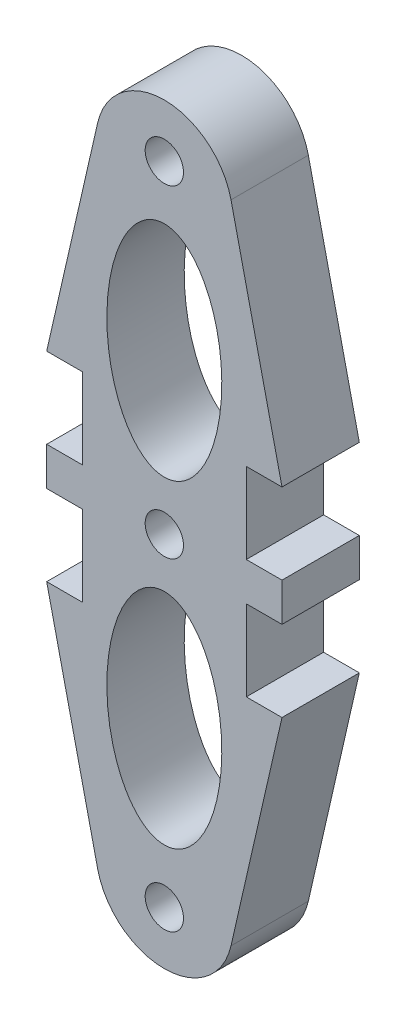
ISO-10303-21;
HEADER;
FILE_DESCRIPTION(('STEP AP214'),'2;1');
FILE_NAME('part.step','',(''),(''),'','','');
FILE_SCHEMA(('AUTOMOTIVE_DESIGN { 1 0 10303 214 1 1 1 1 }'));
ENDSEC;
DATA;
#1=APPLICATION_CONTEXT('core data for automotive mechanical design processes');
#2=APPLICATION_PROTOCOL_DEFINITION('international standard','automotive_design',2000,#1);
#3=PRODUCT_CONTEXT('',#1,'mechanical');
#4=PRODUCT('Part','Part','',(#3));
#5=PRODUCT_RELATED_PRODUCT_CATEGORY('part','',(#4));
#6=PRODUCT_DEFINITION_FORMATION('','',#4);
#7=PRODUCT_DEFINITION_CONTEXT('part definition',#1,'design');
#8=PRODUCT_DEFINITION('design','',#6,#7);
#9=PRODUCT_DEFINITION_SHAPE('','',#8);
#10=(LENGTH_UNIT() NAMED_UNIT(*) SI_UNIT(.MILLI.,.METRE.));
#11=(NAMED_UNIT(*) PLANE_ANGLE_UNIT() SI_UNIT($,.RADIAN.));
#12=(NAMED_UNIT(*) SI_UNIT($,.STERADIAN.) SOLID_ANGLE_UNIT());
#13=UNCERTAINTY_MEASURE_WITH_UNIT(LENGTH_MEASURE(1.E-05),#10,'distance_accuracy_value','');
#14=(GEOMETRIC_REPRESENTATION_CONTEXT(3) GLOBAL_UNCERTAINTY_ASSIGNED_CONTEXT((#13)) GLOBAL_UNIT_ASSIGNED_CONTEXT((#10,
#11,#12)) REPRESENTATION_CONTEXT('',''));
#15=CARTESIAN_POINT('',(0.,0.,0.));
#16=DIRECTION('',(0.,0.,1.));
#17=DIRECTION('',(1.,0.,0.));
#18=AXIS2_PLACEMENT_3D('',#15,#16,#17);
#19=CARTESIAN_POINT('',(839.100067992769,191.617907065036,5.85));
#20=DIRECTION('',(0.974903005259074,0.222630030177482,0.));
#21=DIRECTION('',(-0.222630030177482,0.974903005259074,0.));
#22=AXIS2_PLACEMENT_3D('',#19,#20,#21);
#23=PLANE('',#22);
#24=DIRECTION('',(0.222630030177482,-0.974903005259074,0.));
#25=VECTOR('',#24,1.);
#26=CARTESIAN_POINT('',(839.100067992769,191.617907065036,0.));
#27=LINE('',#26,#25);
#28=CARTESIAN_POINT('',(778.759168708765,455.852359196733,0.));
#29=VERTEX_POINT('',#28);
#30=CARTESIAN_POINT('',(782.615047744186,438.967359196733,0.));
#31=VERTEX_POINT('',#30);
#32=EDGE_CURVE('E316',#29,#31,#27,.T.);
#33=ORIENTED_EDGE('',*,*,#32,.T.);
#34=DIRECTION('',(0.,0.,-1.));
#35=VECTOR('',#34,1.);
#36=CARTESIAN_POINT('',(782.615047744186,438.967359196733,5.85));
#37=LINE('',#36,#35);
#38=CARTESIAN_POINT('',(782.615047744186,438.967359196733,5.85));
#39=VERTEX_POINT('',#38);
#40=EDGE_CURVE('E11',#39,#31,#37,.T.);
#41=ORIENTED_EDGE('',*,*,#40,.F.);
#42=DIRECTION('',(0.222630030177482,-0.974903005259074,0.));
#43=VECTOR('',#42,1.);
#44=CARTESIAN_POINT('',(839.100067992769,191.617907065036,5.85));
#45=LINE('',#44,#43);
#46=CARTESIAN_POINT('',(778.759168708765,455.852359196733,5.85));
#47=VERTEX_POINT('',#46);
#48=EDGE_CURVE('E471',#47,#39,#45,.T.);
#49=ORIENTED_EDGE('',*,*,#48,.F.);
#50=DIRECTION('',(0.,0.,-1.));
#51=VECTOR('',#50,1.);
#52=CARTESIAN_POINT('',(778.759168708765,455.852359196733,5.85));
#53=LINE('',#52,#51);
#54=EDGE_CURVE('E381',#47,#29,#53,.T.);
#55=ORIENTED_EDGE('',*,*,#54,.T.);
#56=EDGE_LOOP('',(#33,#41,#49,#55));
#57=FACE_BOUND('',#56,.T.);
#58=ADVANCED_FACE('F37',(#57),#23,.F.);
#59=CARTESIAN_POINT('',(787.659168708765,440.119240764956,5.85));
#60=DIRECTION('',(0.,0.,-1.));
#61=DIRECTION('',(-1.,0.,0.));
#62=AXIS2_PLACEMENT_3D('',#59,#60,#61);
#63=CYLINDRICAL_SURFACE('',#62,5.17397211555331);
#64=CARTESIAN_POINT('',(787.659168708765,440.119240764956,0.));
#65=DIRECTION('',(0.,0.,1.));
#66=DIRECTION('',(1.,0.,0.));
#67=AXIS2_PLACEMENT_3D('',#64,#65,#66);
#68=CIRCLE('',#67,5.17397211555331);
#69=CARTESIAN_POINT('',(792.703289673345,438.967359196733,0.));
#70=VERTEX_POINT('',#69);
#71=EDGE_CURVE('E320',#31,#70,#68,.T.);
#72=ORIENTED_EDGE('',*,*,#71,.T.);
#73=DIRECTION('',(0.,0.,-1.));
#74=VECTOR('',#73,1.);
#75=CARTESIAN_POINT('',(792.703289673345,438.967359196733,5.85));
#76=LINE('',#75,#74);
#77=CARTESIAN_POINT('',(792.703289673345,438.967359196733,5.85));
#78=VERTEX_POINT('',#77);
#79=EDGE_CURVE('E46',#78,#70,#76,.T.);
#80=ORIENTED_EDGE('',*,*,#79,.F.);
#81=CARTESIAN_POINT('',(787.659168708765,440.119240764956,5.85));
#82=DIRECTION('',(0.,0.,1.));
#83=DIRECTION('',(1.,0.,0.));
#84=AXIS2_PLACEMENT_3D('',#81,#82,#83);
#85=CIRCLE('',#84,5.17397211555331);
#86=EDGE_CURVE('E132',#39,#78,#85,.T.);
#87=ORIENTED_EDGE('',*,*,#86,.F.);
#88=ORIENTED_EDGE('',*,*,#40,.T.);
#89=EDGE_LOOP('',(#72,#80,#87,#88));
#90=FACE_BOUND('',#89,.T.);
#91=ADVANCED_FACE('F296',(#90),#63,.T.);
#92=CARTESIAN_POINT('',(658.138986027007,-150.293415375443,5.85));
#93=DIRECTION('',(-0.974903005259074,0.222630030177482,0.));
#94=DIRECTION('',(-0.222630030177482,-0.974903005259074,0.));
#95=AXIS2_PLACEMENT_3D('',#92,#93,#94);
#96=PLANE('',#95);
#97=DIRECTION('',(0.222630030177482,0.974903005259074,0.));
#98=VECTOR('',#97,1.);
#99=CARTESIAN_POINT('',(658.138986027007,-150.293415375443,0.));
#100=LINE('',#99,#98);
#101=CARTESIAN_POINT('',(796.559168708765,455.852359196733,0.));
#102=VERTEX_POINT('',#101);
#103=EDGE_CURVE('E325',#70,#102,#100,.T.);
#104=ORIENTED_EDGE('',*,*,#103,.T.);
#105=DIRECTION('',(0.,0.,-1.));
#106=VECTOR('',#105,1.);
#107=CARTESIAN_POINT('',(796.559168708765,455.852359196733,5.85));
#108=LINE('',#107,#106);
#109=CARTESIAN_POINT('',(796.559168708765,455.852359196733,5.85));
#110=VERTEX_POINT('',#109);
#111=EDGE_CURVE('E413',#110,#102,#108,.T.);
#112=ORIENTED_EDGE('',*,*,#111,.F.);
#113=DIRECTION('',(0.222630030177482,0.974903005259074,0.));
#114=VECTOR('',#113,1.);
#115=CARTESIAN_POINT('',(658.138986027007,-150.293415375443,5.85));
#116=LINE('',#115,#114);
#117=EDGE_CURVE('E418',#78,#110,#116,.T.);
#118=ORIENTED_EDGE('',*,*,#117,.F.);
#119=ORIENTED_EDGE('',*,*,#79,.T.);
#120=EDGE_LOOP('',(#104,#112,#118,#119));
#121=FACE_BOUND('',#120,.T.);
#122=ADVANCED_FACE('F292',(#121),#96,.F.);
#123=CARTESIAN_POINT('',(9.37218120388744E-12,455.852359196749,5.85));
#124=DIRECTION('',(0.,1.,0.));
#125=DIRECTION('',(-1.,0.,0.));
#126=AXIS2_PLACEMENT_3D('',#123,#124,#125);
#127=PLANE('',#126);
#128=DIRECTION('',(1.,0.,0.));
#129=VECTOR('',#128,1.);
#130=CARTESIAN_POINT('',(9.37218120388744E-12,455.852359196749,0.));
#131=LINE('',#130,#129);
#132=CARTESIAN_POINT('',(793.859168708765,455.852359196733,0.));
#133=VERTEX_POINT('',#132);
#134=EDGE_CURVE('E328',#133,#102,#131,.T.);
#135=ORIENTED_EDGE('',*,*,#134,.F.);
#136=DIRECTION('',(0.,0.,-1.));
#137=VECTOR('',#136,1.);
#138=CARTESIAN_POINT('',(793.859168708765,455.852359196733,5.85));
#139=LINE('',#138,#137);
#140=CARTESIAN_POINT('',(793.859168708765,455.852359196733,5.85));
#141=VERTEX_POINT('',#140);
#142=EDGE_CURVE('E411',#141,#133,#139,.T.);
#143=ORIENTED_EDGE('',*,*,#142,.F.);
#144=DIRECTION('',(1.,0.,0.));
#145=VECTOR('',#144,1.);
#146=CARTESIAN_POINT('',(9.37218120388744E-12,455.852359196749,5.85));
#147=LINE('',#146,#145);
#148=EDGE_CURVE('E428',#141,#110,#147,.T.);
#149=ORIENTED_EDGE('',*,*,#148,.T.);
#150=ORIENTED_EDGE('',*,*,#111,.T.);
#151=EDGE_LOOP('',(#135,#143,#149,#150));
#152=FACE_BOUND('',#151,.T.);
#153=ADVANCED_FACE('F288',(#152),#127,.T.);
#154=CARTESIAN_POINT('',(793.859168708765,0.,5.85));
#155=DIRECTION('',(1.,0.,0.));
#156=DIRECTION('',(0.,0.,-1.));
#157=AXIS2_PLACEMENT_3D('',#154,#155,#156);
#158=PLANE('',#157);
#159=DIRECTION('',(0.,-1.,0.));
#160=VECTOR('',#159,1.);
#161=CARTESIAN_POINT('',(793.859168708765,0.,0.));
#162=LINE('',#161,#160);
#163=CARTESIAN_POINT('',(793.859168708765,461.952359196733,0.));
#164=VERTEX_POINT('',#163);
#165=EDGE_CURVE('E331',#164,#133,#162,.T.);
#166=ORIENTED_EDGE('',*,*,#165,.F.);
#167=DIRECTION('',(0.,0.,-1.));
#168=VECTOR('',#167,1.);
#169=CARTESIAN_POINT('',(793.859168708765,461.952359196733,5.85));
#170=LINE('',#169,#168);
#171=CARTESIAN_POINT('',(793.859168708765,461.952359196733,5.85));
#172=VERTEX_POINT('',#171);
#173=EDGE_CURVE('E409',#172,#164,#170,.T.);
#174=ORIENTED_EDGE('',*,*,#173,.F.);
#175=DIRECTION('',(0.,-1.,0.));
#176=VECTOR('',#175,1.);
#177=CARTESIAN_POINT('',(793.859168708765,0.,5.85));
#178=LINE('',#177,#176);
#179=EDGE_CURVE('E431',#172,#141,#178,.T.);
#180=ORIENTED_EDGE('',*,*,#179,.T.);
#181=ORIENTED_EDGE('',*,*,#142,.T.);
#182=EDGE_LOOP('',(#166,#174,#180,#181));
#183=FACE_BOUND('',#182,.T.);
#184=ADVANCED_FACE('F284',(#183),#158,.T.);
#185=CARTESIAN_POINT('',(9.4975952862988E-12,461.952359196749,5.85));
#186=DIRECTION('',(0.,1.,0.));
#187=DIRECTION('',(-1.,0.,0.));
#188=AXIS2_PLACEMENT_3D('',#185,#186,#187);
#189=PLANE('',#188);
#190=DIRECTION('',(1.,0.,0.));
#191=VECTOR('',#190,1.);
#192=CARTESIAN_POINT('',(9.4975952862988E-12,461.952359196749,0.));
#193=LINE('',#192,#191);
#194=CARTESIAN_POINT('',(796.559168708765,461.952359196733,0.));
#195=VERTEX_POINT('',#194);
#196=EDGE_CURVE('E334',#164,#195,#193,.T.);
#197=ORIENTED_EDGE('',*,*,#196,.T.);
#198=DIRECTION('',(0.,0.,-1.));
#199=VECTOR('',#198,1.);
#200=CARTESIAN_POINT('',(796.559168708765,461.952359196733,5.85));
#201=LINE('',#200,#199);
#202=CARTESIAN_POINT('',(796.559168708765,461.952359196733,5.85));
#203=VERTEX_POINT('',#202);
#204=EDGE_CURVE('E407',#203,#195,#201,.T.);
#205=ORIENTED_EDGE('',*,*,#204,.F.);
#206=DIRECTION('',(1.,0.,0.));
#207=VECTOR('',#206,1.);
#208=CARTESIAN_POINT('',(9.4975952862988E-12,461.952359196749,5.85));
#209=LINE('',#208,#207);
#210=EDGE_CURVE('E433',#172,#203,#209,.T.);
#211=ORIENTED_EDGE('',*,*,#210,.F.);
#212=ORIENTED_EDGE('',*,*,#173,.T.);
#213=EDGE_LOOP('',(#197,#205,#211,#212));
#214=FACE_BOUND('',#213,.T.);
#215=ADVANCED_FACE('F280',(#214),#189,.F.);
#216=CARTESIAN_POINT('',(796.559168708765,0.,5.85));
#217=DIRECTION('',(1.,0.,0.));
#218=DIRECTION('',(0.,0.,-1.));
#219=AXIS2_PLACEMENT_3D('',#216,#217,#218);
#220=PLANE('',#219);
#221=DIRECTION('',(0.,-1.,0.));
#222=VECTOR('',#221,1.);
#223=CARTESIAN_POINT('',(796.559168708765,0.,0.));
#224=LINE('',#223,#222);
#225=CARTESIAN_POINT('',(796.559168708765,464.852359196733,0.));
#226=VERTEX_POINT('',#225);
#227=EDGE_CURVE('E337',#226,#195,#224,.T.);
#228=ORIENTED_EDGE('',*,*,#227,.F.);
#229=DIRECTION('',(0.,0.,-1.));
#230=VECTOR('',#229,1.);
#231=CARTESIAN_POINT('',(796.559168708765,464.852359196733,5.85));
#232=LINE('',#231,#230);
#233=CARTESIAN_POINT('',(796.559168708765,464.852359196733,5.85));
#234=VERTEX_POINT('',#233);
#235=EDGE_CURVE('E405',#234,#226,#232,.T.);
#236=ORIENTED_EDGE('',*,*,#235,.F.);
#237=DIRECTION('',(0.,-1.,0.));
#238=VECTOR('',#237,1.);
#239=CARTESIAN_POINT('',(796.559168708765,0.,5.85));
#240=LINE('',#239,#238);
#241=EDGE_CURVE('E439',#234,#203,#240,.T.);
#242=ORIENTED_EDGE('',*,*,#241,.T.);
#243=ORIENTED_EDGE('',*,*,#204,.T.);
#244=EDGE_LOOP('',(#228,#236,#242,#243));
#245=FACE_BOUND('',#244,.T.);
#246=ADVANCED_FACE('F276',(#245),#220,.T.);
#247=CARTESIAN_POINT('',(-9.55721837465762E-12,464.852359196716,5.85));
#248=DIRECTION('',(0.,1.,0.));
#249=DIRECTION('',(-1.,0.,0.));
#250=AXIS2_PLACEMENT_3D('',#247,#248,#249);
#251=PLANE('',#250);
#252=DIRECTION('',(1.,0.,0.));
#253=VECTOR('',#252,1.);
#254=CARTESIAN_POINT('',(-9.55721837465762E-12,464.852359196716,0.));
#255=LINE('',#254,#253);
#256=CARTESIAN_POINT('',(793.859168708765,464.852359196733,0.));
#257=VERTEX_POINT('',#256);
#258=EDGE_CURVE('E340',#257,#226,#255,.T.);
#259=ORIENTED_EDGE('',*,*,#258,.F.);
#260=DIRECTION('',(0.,0.,-1.));
#261=VECTOR('',#260,1.);
#262=CARTESIAN_POINT('',(793.859168708765,464.852359196733,5.85));
#263=LINE('',#262,#261);
#264=CARTESIAN_POINT('',(793.859168708765,464.852359196733,5.85));
#265=VERTEX_POINT('',#264);
#266=EDGE_CURVE('E403',#265,#257,#263,.T.);
#267=ORIENTED_EDGE('',*,*,#266,.F.);
#268=DIRECTION('',(1.,0.,0.));
#269=VECTOR('',#268,1.);
#270=CARTESIAN_POINT('',(-9.55721837465762E-12,464.852359196716,5.85));
#271=LINE('',#270,#269);
#272=EDGE_CURVE('E442',#265,#234,#271,.T.);
#273=ORIENTED_EDGE('',*,*,#272,.T.);
#274=ORIENTED_EDGE('',*,*,#235,.T.);
#275=EDGE_LOOP('',(#259,#267,#273,#274));
#276=FACE_BOUND('',#275,.T.);
#277=ADVANCED_FACE('F272',(#276),#251,.T.);
#278=CARTESIAN_POINT('',(793.859168708765,0.,5.85));
#279=DIRECTION('',(-1.,0.,0.));
#280=DIRECTION('',(0.,0.,1.));
#281=AXIS2_PLACEMENT_3D('',#278,#279,#280);
#282=PLANE('',#281);
#283=DIRECTION('',(0.,1.,0.));
#284=VECTOR('',#283,1.);
#285=CARTESIAN_POINT('',(793.859168708765,0.,0.));
#286=LINE('',#285,#284);
#287=CARTESIAN_POINT('',(793.859168708765,470.952359196733,0.));
#288=VERTEX_POINT('',#287);
#289=EDGE_CURVE('E343',#257,#288,#286,.T.);
#290=ORIENTED_EDGE('',*,*,#289,.T.);
#291=DIRECTION('',(0.,0.,-1.));
#292=VECTOR('',#291,1.);
#293=CARTESIAN_POINT('',(793.859168708765,470.952359196733,5.85));
#294=LINE('',#293,#292);
#295=CARTESIAN_POINT('',(793.859168708765,470.952359196733,5.85));
#296=VERTEX_POINT('',#295);
#297=EDGE_CURVE('E400',#296,#288,#294,.T.);
#298=ORIENTED_EDGE('',*,*,#297,.F.);
#299=DIRECTION('',(0.,1.,0.));
#300=VECTOR('',#299,1.);
#301=CARTESIAN_POINT('',(793.859168708765,0.,5.85));
#302=LINE('',#301,#300);
#303=EDGE_CURVE('E445',#265,#296,#302,.T.);
#304=ORIENTED_EDGE('',*,*,#303,.F.);
#305=ORIENTED_EDGE('',*,*,#266,.T.);
#306=EDGE_LOOP('',(#290,#298,#304,#305));
#307=FACE_BOUND('',#306,.T.);
#308=ADVANCED_FACE('F268',(#307),#282,.F.);
#309=CARTESIAN_POINT('',(-9.68263245706898E-12,470.952359196717,5.85));
#310=DIRECTION('',(0.,1.,0.));
#311=DIRECTION('',(-1.,0.,0.));
#312=AXIS2_PLACEMENT_3D('',#309,#310,#311);
#313=PLANE('',#312);
#314=DIRECTION('',(1.,0.,0.));
#315=VECTOR('',#314,1.);
#316=CARTESIAN_POINT('',(-9.68263245706898E-12,470.952359196717,0.));
#317=LINE('',#316,#315);
#318=CARTESIAN_POINT('',(796.559168708765,470.952359196733,0.));
#319=VERTEX_POINT('',#318);
#320=EDGE_CURVE('E345',#288,#319,#317,.T.);
#321=ORIENTED_EDGE('',*,*,#320,.T.);
#322=DIRECTION('',(0.,0.,-1.));
#323=VECTOR('',#322,1.);
#324=CARTESIAN_POINT('',(796.559168708765,470.952359196733,5.85));
#325=LINE('',#324,#323);
#326=CARTESIAN_POINT('',(796.559168708765,470.952359196733,5.85));
#327=VERTEX_POINT('',#326);
#328=EDGE_CURVE('E398',#327,#319,#325,.T.);
#329=ORIENTED_EDGE('',*,*,#328,.F.);
#330=DIRECTION('',(1.,0.,0.));
#331=VECTOR('',#330,1.);
#332=CARTESIAN_POINT('',(-9.68263245706898E-12,470.952359196717,5.85));
#333=LINE('',#332,#331);
#334=EDGE_CURVE('E447',#296,#327,#333,.T.);
#335=ORIENTED_EDGE('',*,*,#334,.F.);
#336=ORIENTED_EDGE('',*,*,#297,.T.);
#337=EDGE_LOOP('',(#321,#329,#335,#336));
#338=FACE_BOUND('',#337,.T.);
#339=ADVANCED_FACE('F264',(#338),#313,.F.);
#340=CARTESIAN_POINT('',(859.295171023536,196.229685234684,5.85));
#341=DIRECTION('',(0.974903005259073,0.222630030177483,0.));
#342=DIRECTION('',(-0.222630030177483,0.974903005259073,0.));
#343=AXIS2_PLACEMENT_3D('',#340,#341,#342);
#344=PLANE('',#343);
#345=DIRECTION('',(0.222630030177483,-0.974903005259073,0.));
#346=VECTOR('',#345,1.);
#347=CARTESIAN_POINT('',(859.295171023536,196.229685234684,0.));
#348=LINE('',#347,#346);
#349=CARTESIAN_POINT('',(792.703289673345,487.837359196733,0.));
#350=VERTEX_POINT('',#349);
#351=EDGE_CURVE('E348',#350,#319,#348,.T.);
#352=ORIENTED_EDGE('',*,*,#351,.F.);
#353=DIRECTION('',(0.,0.,-1.));
#354=VECTOR('',#353,1.);
#355=CARTESIAN_POINT('',(792.703289673345,487.837359196733,5.85));
#356=LINE('',#355,#354);
#357=CARTESIAN_POINT('',(792.703289673345,487.837359196733,5.85));
#358=VERTEX_POINT('',#357);
#359=EDGE_CURVE('E396',#358,#350,#356,.T.);
#360=ORIENTED_EDGE('',*,*,#359,.F.);
#361=DIRECTION('',(0.222630030177483,-0.974903005259073,0.));
#362=VECTOR('',#361,1.);
#363=CARTESIAN_POINT('',(859.295171023536,196.229685234684,5.85));
#364=LINE('',#363,#362);
#365=EDGE_CURVE('E449',#358,#327,#364,.T.);
#366=ORIENTED_EDGE('',*,*,#365,.T.);
#367=ORIENTED_EDGE('',*,*,#328,.T.);
#368=EDGE_LOOP('',(#352,#360,#366,#367));
#369=FACE_BOUND('',#368,.T.);
#370=ADVANCED_FACE('F260',(#369),#344,.T.);
#371=CARTESIAN_POINT('',(787.659168708765,486.68547762851,5.85));
#372=DIRECTION('',(0.,0.,-1.));
#373=DIRECTION('',(-1.,0.,0.));
#374=AXIS2_PLACEMENT_3D('',#371,#372,#373);
#375=CYLINDRICAL_SURFACE('',#374,5.17397211555331);
#376=CARTESIAN_POINT('',(787.659168708765,486.68547762851,0.));
#377=DIRECTION('',(0.,0.,1.));
#378=DIRECTION('',(1.,0.,0.));
#379=AXIS2_PLACEMENT_3D('',#376,#377,#378);
#380=CIRCLE('',#379,5.17397211555331);
#381=CARTESIAN_POINT('',(782.615047744186,487.837359196733,0.));
#382=VERTEX_POINT('',#381);
#383=EDGE_CURVE('E351',#382,#350,#380,.F.);
#384=ORIENTED_EDGE('',*,*,#383,.F.);
#385=DIRECTION('',(0.,0.,-1.));
#386=VECTOR('',#385,1.);
#387=CARTESIAN_POINT('',(782.615047744186,487.837359196733,5.85));
#388=LINE('',#387,#386);
#389=CARTESIAN_POINT('',(782.615047744186,487.837359196733,5.85));
#390=VERTEX_POINT('',#389);
#391=EDGE_CURVE('E394',#390,#382,#388,.T.);
#392=ORIENTED_EDGE('',*,*,#391,.F.);
#393=CARTESIAN_POINT('',(787.659168708765,486.68547762851,5.85));
#394=DIRECTION('',(0.,0.,1.));
#395=DIRECTION('',(1.,0.,0.));
#396=AXIS2_PLACEMENT_3D('',#393,#394,#395);
#397=CIRCLE('',#396,5.17397211555331);
#398=EDGE_CURVE('E452',#390,#358,#397,.F.);
#399=ORIENTED_EDGE('',*,*,#398,.T.);
#400=ORIENTED_EDGE('',*,*,#359,.T.);
#401=EDGE_LOOP('',(#384,#392,#399,#400));
#402=FACE_BOUND('',#401,.T.);
#403=ADVANCED_FACE('F256',(#402),#375,.T.);
#404=CARTESIAN_POINT('',(637.943882996239,-145.681637205797,5.85));
#405=DIRECTION('',(-0.974903005259073,0.222630030177483,0.));
#406=DIRECTION('',(-0.222630030177483,-0.974903005259073,0.));
#407=AXIS2_PLACEMENT_3D('',#404,#405,#406);
#408=PLANE('',#407);
#409=DIRECTION('',(0.222630030177483,0.974903005259073,0.));
#410=VECTOR('',#409,1.);
#411=CARTESIAN_POINT('',(637.943882996239,-145.681637205797,0.));
#412=LINE('',#411,#410);
#413=CARTESIAN_POINT('',(778.759168708765,470.952359196733,0.));
#414=VERTEX_POINT('',#413);
#415=EDGE_CURVE('E354',#414,#382,#412,.T.);
#416=ORIENTED_EDGE('',*,*,#415,.F.);
#417=DIRECTION('',(0.,0.,-1.));
#418=VECTOR('',#417,1.);
#419=CARTESIAN_POINT('',(778.759168708765,470.952359196733,5.85));
#420=LINE('',#419,#418);
#421=CARTESIAN_POINT('',(778.759168708765,470.952359196733,5.85));
#422=VERTEX_POINT('',#421);
#423=EDGE_CURVE('E392',#422,#414,#420,.T.);
#424=ORIENTED_EDGE('',*,*,#423,.F.);
#425=DIRECTION('',(0.222630030177483,0.974903005259073,0.));
#426=VECTOR('',#425,1.);
#427=CARTESIAN_POINT('',(637.943882996239,-145.681637205797,5.85));
#428=LINE('',#427,#426);
#429=EDGE_CURVE('E455',#422,#390,#428,.T.);
#430=ORIENTED_EDGE('',*,*,#429,.T.);
#431=ORIENTED_EDGE('',*,*,#391,.T.);
#432=EDGE_LOOP('',(#416,#424,#430,#431));
#433=FACE_BOUND('',#432,.T.);
#434=ADVANCED_FACE('F252',(#433),#408,.T.);
#435=CARTESIAN_POINT('',(9.68263245706964E-12,470.952359196749,5.85));
#436=DIRECTION('',(0.,-1.,0.));
#437=DIRECTION('',(1.,0.,0.));
#438=AXIS2_PLACEMENT_3D('',#435,#436,#437);
#439=PLANE('',#438);
#440=DIRECTION('',(-1.,0.,0.));
#441=VECTOR('',#440,1.);
#442=CARTESIAN_POINT('',(9.68263245706964E-12,470.952359196749,0.));
#443=LINE('',#442,#441);
#444=CARTESIAN_POINT('',(781.459168708765,470.952359196733,0.));
#445=VERTEX_POINT('',#444);
#446=EDGE_CURVE('E357',#445,#414,#443,.T.);
#447=ORIENTED_EDGE('',*,*,#446,.F.);
#448=DIRECTION('',(0.,0.,-1.));
#449=VECTOR('',#448,1.);
#450=CARTESIAN_POINT('',(781.459168708765,470.952359196733,5.85));
#451=LINE('',#450,#449);
#452=CARTESIAN_POINT('',(781.459168708765,470.952359196733,5.85));
#453=VERTEX_POINT('',#452);
#454=EDGE_CURVE('E390',#453,#445,#451,.T.);
#455=ORIENTED_EDGE('',*,*,#454,.F.);
#456=DIRECTION('',(-1.,0.,0.));
#457=VECTOR('',#456,1.);
#458=CARTESIAN_POINT('',(9.68263245706964E-12,470.952359196749,5.85));
#459=LINE('',#458,#457);
#460=EDGE_CURVE('E458',#453,#422,#459,.T.);
#461=ORIENTED_EDGE('',*,*,#460,.T.);
#462=ORIENTED_EDGE('',*,*,#423,.T.);
#463=EDGE_LOOP('',(#447,#455,#461,#462));
#464=FACE_BOUND('',#463,.T.);
#465=ADVANCED_FACE('F248',(#464),#439,.T.);
#466=CARTESIAN_POINT('',(781.459168708765,0.,5.85));
#467=DIRECTION('',(-1.,0.,0.));
#468=DIRECTION('',(0.,0.,1.));
#469=AXIS2_PLACEMENT_3D('',#466,#467,#468);
#470=PLANE('',#469);
#471=DIRECTION('',(0.,1.,0.));
#472=VECTOR('',#471,1.);
#473=CARTESIAN_POINT('',(781.459168708765,0.,0.));
#474=LINE('',#473,#472);
#475=CARTESIAN_POINT('',(781.459168708765,464.852359196733,0.));
#476=VERTEX_POINT('',#475);
#477=EDGE_CURVE('E360',#476,#445,#474,.T.);
#478=ORIENTED_EDGE('',*,*,#477,.F.);
#479=DIRECTION('',(0.,0.,-1.));
#480=VECTOR('',#479,1.);
#481=CARTESIAN_POINT('',(781.459168708765,464.852359196733,5.85));
#482=LINE('',#481,#480);
#483=CARTESIAN_POINT('',(781.459168708765,464.852359196733,5.85));
#484=VERTEX_POINT('',#483);
#485=EDGE_CURVE('E388',#484,#476,#482,.T.);
#486=ORIENTED_EDGE('',*,*,#485,.F.);
#487=DIRECTION('',(0.,1.,0.));
#488=VECTOR('',#487,1.);
#489=CARTESIAN_POINT('',(781.459168708765,0.,5.85));
#490=LINE('',#489,#488);
#491=EDGE_CURVE('E461',#484,#453,#490,.T.);
#492=ORIENTED_EDGE('',*,*,#491,.T.);
#493=ORIENTED_EDGE('',*,*,#454,.T.);
#494=EDGE_LOOP('',(#478,#486,#492,#493));
#495=FACE_BOUND('',#494,.T.);
#496=ADVANCED_FACE('F244',(#495),#470,.T.);
#497=CARTESIAN_POINT('',(9.55721837465828E-12,464.852359196749,5.85));
#498=DIRECTION('',(0.,-1.,0.));
#499=DIRECTION('',(1.,0.,0.));
#500=AXIS2_PLACEMENT_3D('',#497,#498,#499);
#501=PLANE('',#500);
#502=DIRECTION('',(-1.,0.,0.));
#503=VECTOR('',#502,1.);
#504=CARTESIAN_POINT('',(9.55721837465828E-12,464.852359196749,0.));
#505=LINE('',#504,#503);
#506=CARTESIAN_POINT('',(778.759168708765,464.852359196733,0.));
#507=VERTEX_POINT('',#506);
#508=EDGE_CURVE('E363',#476,#507,#505,.T.);
#509=ORIENTED_EDGE('',*,*,#508,.T.);
#510=DIRECTION('',(0.,0.,-1.));
#511=VECTOR('',#510,1.);
#512=CARTESIAN_POINT('',(778.759168708765,464.852359196733,5.85));
#513=LINE('',#512,#511);
#514=CARTESIAN_POINT('',(778.759168708765,464.852359196733,5.85));
#515=VERTEX_POINT('',#514);
#516=EDGE_CURVE('E385',#515,#507,#513,.T.);
#517=ORIENTED_EDGE('',*,*,#516,.F.);
#518=DIRECTION('',(-1.,0.,0.));
#519=VECTOR('',#518,1.);
#520=CARTESIAN_POINT('',(9.55721837465828E-12,464.852359196749,5.85));
#521=LINE('',#520,#519);
#522=EDGE_CURVE('E202',#484,#515,#521,.T.);
#523=ORIENTED_EDGE('',*,*,#522,.F.);
#524=ORIENTED_EDGE('',*,*,#485,.T.);
#525=EDGE_LOOP('',(#509,#517,#523,#524));
#526=FACE_BOUND('',#525,.T.);
#527=ADVANCED_FACE('F240',(#526),#501,.F.);
#528=CARTESIAN_POINT('',(778.759168708765,0.,5.85));
#529=DIRECTION('',(1.,0.,0.));
#530=DIRECTION('',(0.,0.,-1.));
#531=AXIS2_PLACEMENT_3D('',#528,#529,#530);
#532=PLANE('',#531);
#533=DIRECTION('',(0.,-1.,0.));
#534=VECTOR('',#533,1.);
#535=CARTESIAN_POINT('',(778.759168708765,0.,0.));
#536=LINE('',#535,#534);
#537=CARTESIAN_POINT('',(778.759168708765,461.952359196733,0.));
#538=VERTEX_POINT('',#537);
#539=EDGE_CURVE('E365',#507,#538,#536,.T.);
#540=ORIENTED_EDGE('',*,*,#539,.T.);
#541=DIRECTION('',(0.,0.,-1.));
#542=VECTOR('',#541,1.);
#543=CARTESIAN_POINT('',(778.759168708765,461.952359196733,5.85));
#544=LINE('',#543,#542);
#545=CARTESIAN_POINT('',(778.759168708765,461.952359196733,5.85));
#546=VERTEX_POINT('',#545);
#547=EDGE_CURVE('E190',#546,#538,#544,.T.);
#548=ORIENTED_EDGE('',*,*,#547,.F.);
#549=DIRECTION('',(0.,-1.,0.));
#550=VECTOR('',#549,1.);
#551=CARTESIAN_POINT('',(778.759168708765,0.,5.85));
#552=LINE('',#551,#550);
#553=EDGE_CURVE('E199',#515,#546,#552,.T.);
#554=ORIENTED_EDGE('',*,*,#553,.F.);
#555=ORIENTED_EDGE('',*,*,#516,.T.);
#556=EDGE_LOOP('',(#540,#548,#554,#555));
#557=FACE_BOUND('',#556,.T.);
#558=ADVANCED_FACE('F237',(#557),#532,.F.);
#559=CARTESIAN_POINT('',(-9.49759528629813E-12,461.952359196717,5.85));
#560=DIRECTION('',(0.,-1.,0.));
#561=DIRECTION('',(1.,0.,0.));
#562=AXIS2_PLACEMENT_3D('',#559,#560,#561);
#563=PLANE('',#562);
#564=DIRECTION('',(-1.,0.,0.));
#565=VECTOR('',#564,1.);
#566=CARTESIAN_POINT('',(-9.49759528629813E-12,461.952359196717,0.));
#567=LINE('',#566,#565);
#568=CARTESIAN_POINT('',(781.459168708765,461.952359196733,0.));
#569=VERTEX_POINT('',#568);
#570=EDGE_CURVE('E189',#569,#538,#567,.T.);
#571=ORIENTED_EDGE('',*,*,#570,.F.);
#572=DIRECTION('',(0.,0.,-1.));
#573=VECTOR('',#572,1.);
#574=CARTESIAN_POINT('',(781.459168708765,461.952359196733,5.85));
#575=LINE('',#574,#573);
#576=CARTESIAN_POINT('',(781.459168708765,461.952359196733,5.85));
#577=VERTEX_POINT('',#576);
#578=EDGE_CURVE('E183',#577,#569,#575,.T.);
#579=ORIENTED_EDGE('',*,*,#578,.F.);
#580=DIRECTION('',(-1.,0.,0.));
#581=VECTOR('',#580,1.);
#582=CARTESIAN_POINT('',(-9.49759528629813E-12,461.952359196717,5.85));
#583=LINE('',#582,#581);
#584=EDGE_CURVE('E187',#577,#546,#583,.T.);
#585=ORIENTED_EDGE('',*,*,#584,.T.);
#586=ORIENTED_EDGE('',*,*,#547,.T.);
#587=EDGE_LOOP('',(#571,#579,#585,#586));
#588=FACE_BOUND('',#587,.T.);
#589=ADVANCED_FACE('F185',(#588),#563,.T.);
#590=CARTESIAN_POINT('',(781.459168708765,0.,5.85));
#591=DIRECTION('',(1.,0.,0.));
#592=DIRECTION('',(0.,0.,-1.));
#593=AXIS2_PLACEMENT_3D('',#590,#591,#592);
#594=PLANE('',#593);
#595=DIRECTION('',(0.,-1.,0.));
#596=VECTOR('',#595,1.);
#597=CARTESIAN_POINT('',(781.459168708765,0.,0.));
#598=LINE('',#597,#596);
#599=CARTESIAN_POINT('',(781.459168708765,455.852359196733,0.));
#600=VERTEX_POINT('',#599);
#601=EDGE_CURVE('E118',#569,#600,#598,.T.);
#602=ORIENTED_EDGE('',*,*,#601,.T.);
#603=DIRECTION('',(0.,0.,-1.));
#604=VECTOR('',#603,1.);
#605=CARTESIAN_POINT('',(781.459168708765,455.852359196733,5.85));
#606=LINE('',#605,#604);
#607=CARTESIAN_POINT('',(781.459168708765,455.852359196733,5.85));
#608=VERTEX_POINT('',#607);
#609=EDGE_CURVE('E191',#608,#600,#606,.T.);
#610=ORIENTED_EDGE('',*,*,#609,.F.);
#611=DIRECTION('',(0.,-1.,0.));
#612=VECTOR('',#611,1.);
#613=CARTESIAN_POINT('',(781.459168708765,0.,5.85));
#614=LINE('',#613,#612);
#615=EDGE_CURVE('E193',#577,#608,#614,.T.);
#616=ORIENTED_EDGE('',*,*,#615,.F.);
#617=ORIENTED_EDGE('',*,*,#578,.T.);
#618=EDGE_LOOP('',(#602,#610,#616,#617));
#619=FACE_BOUND('',#618,.T.);
#620=ADVANCED_FACE('F194',(#619),#594,.F.);
#621=CARTESIAN_POINT('',(787.659168708765,475.44811823758,5.85));
#622=DIRECTION('',(0.,0.,1.));
#623=DIRECTION('',(0.,1.,0.));
#624=AXIS2_PLACEMENT_3D('',#621,#622,#623);
#625=ELLIPSE('',#624,8.30208055455728,4.34649741649051);
#626=DIRECTION('',(0.,0.,-1.));
#627=VECTOR('',#626,1.);
#628=SURFACE_OF_LINEAR_EXTRUSION('',#625,#627);
#629=CARTESIAN_POINT('',(787.659168708765,483.750198792137,5.85));
#630=VERTEX_POINT('',#629);
#631=EDGE_CURVE('E210',#630,#630,#625,.T.);
#632=ORIENTED_EDGE('',*,*,#631,.T.);
#633=EDGE_LOOP('',(#632));
#634=FACE_BOUND('',#633,.T.);
#635=CARTESIAN_POINT('',(787.659168708765,475.44811823758,0.));
#636=DIRECTION('',(0.,0.,1.));
#637=DIRECTION('',(0.,1.,0.));
#638=AXIS2_PLACEMENT_3D('',#635,#636,#637);
#639=ELLIPSE('',#638,8.30208055455728,4.34649741649051);
#640=CARTESIAN_POINT('',(787.659168708765,483.750198792137,0.));
#641=VERTEX_POINT('',#640);
#642=EDGE_CURVE('E374',#641,#641,#639,.T.);
#643=ORIENTED_EDGE('',*,*,#642,.F.);
#644=EDGE_LOOP('',(#643));
#645=FACE_BOUND('',#644,.T.);
#646=ADVANCED_FACE('F218',(#634,#645),#628,.T.);
#647=CARTESIAN_POINT('',(787.659168708765,463.402359196733,5.85));
#648=DIRECTION('',(0.,0.,-1.));
#649=DIRECTION('',(-1.,0.,0.));
#650=AXIS2_PLACEMENT_3D('',#647,#648,#649);
#651=CYLINDRICAL_SURFACE('',#650,1.44999999999994);
#652=CARTESIAN_POINT('',(787.659168708765,463.402359196733,5.85));
#653=DIRECTION('',(0.,0.,1.));
#654=DIRECTION('',(1.,0.,0.));
#655=AXIS2_PLACEMENT_3D('',#652,#653,#654);
#656=CIRCLE('',#655,1.44999999999994);
#657=CARTESIAN_POINT('',(789.109168708765,463.402359196733,5.85));
#658=VERTEX_POINT('',#657);
#659=EDGE_CURVE('E207',#658,#658,#656,.T.);
#660=ORIENTED_EDGE('',*,*,#659,.T.);
#661=EDGE_LOOP('',(#660));
#662=FACE_BOUND('',#661,.T.);
#663=CARTESIAN_POINT('',(787.659168708765,463.402359196733,0.));
#664=DIRECTION('',(0.,0.,1.));
#665=DIRECTION('',(1.,0.,0.));
#666=AXIS2_PLACEMENT_3D('',#663,#664,#665);
#667=CIRCLE('',#666,1.44999999999994);
#668=CARTESIAN_POINT('',(789.109168708765,463.402359196733,0.));
#669=VERTEX_POINT('',#668);
#670=EDGE_CURVE('E371',#669,#669,#667,.T.);
#671=ORIENTED_EDGE('',*,*,#670,.F.);
#672=EDGE_LOOP('',(#671));
#673=FACE_BOUND('',#672,.T.);
#674=ADVANCED_FACE('F222',(#662,#673),#651,.F.);
#675=CARTESIAN_POINT('',(-9.37218120388677E-12,455.852359196717,5.85));
#676=DIRECTION('',(0.,-1.,0.));
#677=DIRECTION('',(1.,0.,0.));
#678=AXIS2_PLACEMENT_3D('',#675,#676,#677);
#679=PLANE('',#678);
#680=DIRECTION('',(-1.,0.,0.));
#681=VECTOR('',#680,1.);
#682=CARTESIAN_POINT('',(-9.37218120388677E-12,455.852359196717,0.));
#683=LINE('',#682,#681);
#684=EDGE_CURVE('E124',#600,#29,#683,.T.);
#685=ORIENTED_EDGE('',*,*,#684,.T.);
#686=ORIENTED_EDGE('',*,*,#54,.F.);
#687=DIRECTION('',(-1.,0.,0.));
#688=VECTOR('',#687,1.);
#689=CARTESIAN_POINT('',(-9.37218120388677E-12,455.852359196717,5.85));
#690=LINE('',#689,#688);
#691=EDGE_CURVE('E54',#608,#47,#690,.T.);
#692=ORIENTED_EDGE('',*,*,#691,.F.);
#693=ORIENTED_EDGE('',*,*,#609,.T.);
#694=EDGE_LOOP('',(#685,#686,#692,#693));
#695=FACE_BOUND('',#694,.T.);
#696=ADVANCED_FACE('F228',(#695),#679,.F.);
#697=CARTESIAN_POINT('',(787.659168708765,487.837359196733,5.85));
#698=DIRECTION('',(0.,0.,-1.));
#699=DIRECTION('',(-1.,0.,0.));
#700=AXIS2_PLACEMENT_3D('',#697,#698,#699);
#701=CYLINDRICAL_SURFACE('',#700,1.44999999999994);
#702=CARTESIAN_POINT('',(787.659168708765,487.837359196733,5.85));
#703=DIRECTION('',(0.,0.,1.));
#704=DIRECTION('',(1.,0.,0.));
#705=AXIS2_PLACEMENT_3D('',#702,#703,#704);
#706=CIRCLE('',#705,1.44999999999994);
#707=CARTESIAN_POINT('',(789.109168708765,487.837359196733,5.85));
#708=VERTEX_POINT('',#707);
#709=EDGE_CURVE('E311',#708,#708,#706,.T.);
#710=ORIENTED_EDGE('',*,*,#709,.T.);
#711=EDGE_LOOP('',(#710));
#712=FACE_BOUND('',#711,.T.);
#713=CARTESIAN_POINT('',(787.659168708765,487.837359196733,0.));
#714=DIRECTION('',(0.,0.,1.));
#715=DIRECTION('',(1.,0.,0.));
#716=AXIS2_PLACEMENT_3D('',#713,#714,#715);
#717=CIRCLE('',#716,1.44999999999994);
#718=CARTESIAN_POINT('',(789.109168708765,487.837359196733,0.));
#719=VERTEX_POINT('',#718);
#720=EDGE_CURVE('E314',#719,#719,#717,.T.);
#721=ORIENTED_EDGE('',*,*,#720,.F.);
#722=EDGE_LOOP('',(#721));
#723=FACE_BOUND('',#722,.T.);
#724=ADVANCED_FACE('F232',(#712,#723),#701,.F.);
#725=CARTESIAN_POINT('',(787.659168708765,438.967359196733,5.85));
#726=DIRECTION('',(0.,0.,-1.));
#727=DIRECTION('',(-1.,0.,0.));
#728=AXIS2_PLACEMENT_3D('',#725,#726,#727);
#729=CYLINDRICAL_SURFACE('',#728,1.44999999999994);
#730=CARTESIAN_POINT('',(787.659168708765,438.967359196733,5.85));
#731=DIRECTION('',(0.,0.,1.));
#732=DIRECTION('',(1.,0.,0.));
#733=AXIS2_PLACEMENT_3D('',#730,#731,#732);
#734=CIRCLE('',#733,1.44999999999994);
#735=CARTESIAN_POINT('',(789.109168708765,438.967359196733,5.85));
#736=VERTEX_POINT('',#735);
#737=EDGE_CURVE('E380',#736,#736,#734,.F.);
#738=ORIENTED_EDGE('',*,*,#737,.F.);
#739=EDGE_LOOP('',(#738));
#740=FACE_BOUND('',#739,.T.);
#741=CARTESIAN_POINT('',(787.659168708765,438.967359196733,0.));
#742=DIRECTION('',(0.,0.,1.));
#743=DIRECTION('',(1.,0.,0.));
#744=AXIS2_PLACEMENT_3D('',#741,#742,#743);
#745=CIRCLE('',#744,1.44999999999994);
#746=CARTESIAN_POINT('',(789.109168708765,438.967359196733,0.));
#747=VERTEX_POINT('',#746);
#748=EDGE_CURVE('E317',#747,#747,#745,.F.);
#749=ORIENTED_EDGE('',*,*,#748,.T.);
#750=EDGE_LOOP('',(#749));
#751=FACE_BOUND('',#750,.T.);
#752=ADVANCED_FACE('F39',(#740,#751),#729,.F.);
#753=CARTESIAN_POINT('',(787.659168708765,451.356600155886,5.85));
#754=DIRECTION('',(0.,0.,-1.));
#755=DIRECTION('',(0.,-1.,0.));
#756=AXIS2_PLACEMENT_3D('',#753,#754,#755);
#757=ELLIPSE('',#756,8.30208055455728,4.34649741649051);
#758=DIRECTION('',(0.,0.,-1.));
#759=VECTOR('',#758,1.);
#760=SURFACE_OF_LINEAR_EXTRUSION('',#757,#759);
#761=CARTESIAN_POINT('',(787.659168708765,443.054519601329,5.85));
#762=VERTEX_POINT('',#761);
#763=EDGE_CURVE('E214',#762,#762,#757,.T.);
#764=ORIENTED_EDGE('',*,*,#763,.F.);
#765=EDGE_LOOP('',(#764));
#766=FACE_BOUND('',#765,.T.);
#767=CARTESIAN_POINT('',(787.659168708765,451.356600155886,0.));
#768=DIRECTION('',(0.,0.,-1.));
#769=DIRECTION('',(0.,-1.,0.));
#770=AXIS2_PLACEMENT_3D('',#767,#768,#769);
#771=ELLIPSE('',#770,8.30208055455728,4.34649741649051);
#772=CARTESIAN_POINT('',(787.659168708765,443.054519601329,0.));
#773=VERTEX_POINT('',#772);
#774=EDGE_CURVE('E377',#773,#773,#771,.T.);
#775=ORIENTED_EDGE('',*,*,#774,.T.);
#776=EDGE_LOOP('',(#775));
#777=FACE_BOUND('',#776,.T.);
#778=ADVANCED_FACE('F224',(#766,#777),#760,.F.);
#779=CARTESIAN_POINT('',(0.,0.,5.85));
#780=DIRECTION('',(0.,0.,1.));
#781=DIRECTION('',(1.,0.,0.));
#782=AXIS2_PLACEMENT_3D('',#779,#780,#781);
#783=PLANE('',#782);
#784=ORIENTED_EDGE('',*,*,#737,.T.);
#785=EDGE_LOOP('',(#784));
#786=FACE_BOUND('',#785,.T.);
#787=ORIENTED_EDGE('',*,*,#709,.F.);
#788=EDGE_LOOP('',(#787));
#789=FACE_BOUND('',#788,.T.);
#790=ORIENTED_EDGE('',*,*,#48,.T.);
#791=ORIENTED_EDGE('',*,*,#86,.T.);
#792=ORIENTED_EDGE('',*,*,#117,.T.);
#793=ORIENTED_EDGE('',*,*,#148,.F.);
#794=ORIENTED_EDGE('',*,*,#179,.F.);
#795=ORIENTED_EDGE('',*,*,#210,.T.);
#796=ORIENTED_EDGE('',*,*,#241,.F.);
#797=ORIENTED_EDGE('',*,*,#272,.F.);
#798=ORIENTED_EDGE('',*,*,#303,.T.);
#799=ORIENTED_EDGE('',*,*,#334,.T.);
#800=ORIENTED_EDGE('',*,*,#365,.F.);
#801=ORIENTED_EDGE('',*,*,#398,.F.);
#802=ORIENTED_EDGE('',*,*,#429,.F.);
#803=ORIENTED_EDGE('',*,*,#460,.F.);
#804=ORIENTED_EDGE('',*,*,#491,.F.);
#805=ORIENTED_EDGE('',*,*,#522,.T.);
#806=ORIENTED_EDGE('',*,*,#553,.T.);
#807=ORIENTED_EDGE('',*,*,#584,.F.);
#808=ORIENTED_EDGE('',*,*,#615,.T.);
#809=ORIENTED_EDGE('',*,*,#691,.T.);
#810=EDGE_LOOP('',(#790,#791,#792,#793,#794,#795,#796,#797,#798,#799,#800,#801,#802,#803,#804,
#805,#806,#807,#808,#809));
#811=FACE_BOUND('',#810,.T.);
#812=ORIENTED_EDGE('',*,*,#659,.F.);
#813=EDGE_LOOP('',(#812));
#814=FACE_BOUND('',#813,.T.);
#815=ORIENTED_EDGE('',*,*,#631,.F.);
#816=EDGE_LOOP('',(#815));
#817=FACE_BOUND('',#816,.T.);
#818=ORIENTED_EDGE('',*,*,#763,.T.);
#819=EDGE_LOOP('',(#818));
#820=FACE_BOUND('',#819,.T.);
#821=ADVANCED_FACE('F196',(#786,#789,#811,#814,#817,#820),#783,.T.);
#822=CARTESIAN_POINT('',(0.,0.,0.));
#823=DIRECTION('',(0.,0.,1.));
#824=DIRECTION('',(1.,0.,0.));
#825=AXIS2_PLACEMENT_3D('',#822,#823,#824);
#826=PLANE('',#825);
#827=ORIENTED_EDGE('',*,*,#748,.F.);
#828=EDGE_LOOP('',(#827));
#829=FACE_BOUND('',#828,.T.);
#830=ORIENTED_EDGE('',*,*,#720,.T.);
#831=EDGE_LOOP('',(#830));
#832=FACE_BOUND('',#831,.T.);
#833=ORIENTED_EDGE('',*,*,#32,.F.);
#834=ORIENTED_EDGE('',*,*,#684,.F.);
#835=ORIENTED_EDGE('',*,*,#601,.F.);
#836=ORIENTED_EDGE('',*,*,#570,.T.);
#837=ORIENTED_EDGE('',*,*,#539,.F.);
#838=ORIENTED_EDGE('',*,*,#508,.F.);
#839=ORIENTED_EDGE('',*,*,#477,.T.);
#840=ORIENTED_EDGE('',*,*,#446,.T.);
#841=ORIENTED_EDGE('',*,*,#415,.T.);
#842=ORIENTED_EDGE('',*,*,#383,.T.);
#843=ORIENTED_EDGE('',*,*,#351,.T.);
#844=ORIENTED_EDGE('',*,*,#320,.F.);
#845=ORIENTED_EDGE('',*,*,#289,.F.);
#846=ORIENTED_EDGE('',*,*,#258,.T.);
#847=ORIENTED_EDGE('',*,*,#227,.T.);
#848=ORIENTED_EDGE('',*,*,#196,.F.);
#849=ORIENTED_EDGE('',*,*,#165,.T.);
#850=ORIENTED_EDGE('',*,*,#134,.T.);
#851=ORIENTED_EDGE('',*,*,#103,.F.);
#852=ORIENTED_EDGE('',*,*,#71,.F.);
#853=EDGE_LOOP('',(#833,#834,#835,#836,#837,#838,#839,#840,#841,#842,#843,#844,#845,#846,#847,
#848,#849,#850,#851,#852));
#854=FACE_BOUND('',#853,.T.);
#855=ORIENTED_EDGE('',*,*,#670,.T.);
#856=EDGE_LOOP('',(#855));
#857=FACE_BOUND('',#856,.T.);
#858=ORIENTED_EDGE('',*,*,#642,.T.);
#859=EDGE_LOOP('',(#858));
#860=FACE_BOUND('',#859,.T.);
#861=ORIENTED_EDGE('',*,*,#774,.F.);
#862=EDGE_LOOP('',(#861));
#863=FACE_BOUND('',#862,.T.);
#864=ADVANCED_FACE('F421',(#829,#832,#854,#857,#860,#863),#826,.F.);
#865=CLOSED_SHELL('',(#58,#91,#122,#153,#184,#215,#246,#277,#308,#339,#370,#403,#434,#465,#496,
#527,#558,#589,#620,#646,#674,#696,#724,#752,#778,#821,#864));
#866=MANIFOLD_SOLID_BREP('B2',#865);
#867=ADVANCED_BREP_SHAPE_REPRESENTATION('',(#18,#866),#14);
#868=SHAPE_DEFINITION_REPRESENTATION(#9,#867);
ENDSEC;
END-ISO-10303-21;
